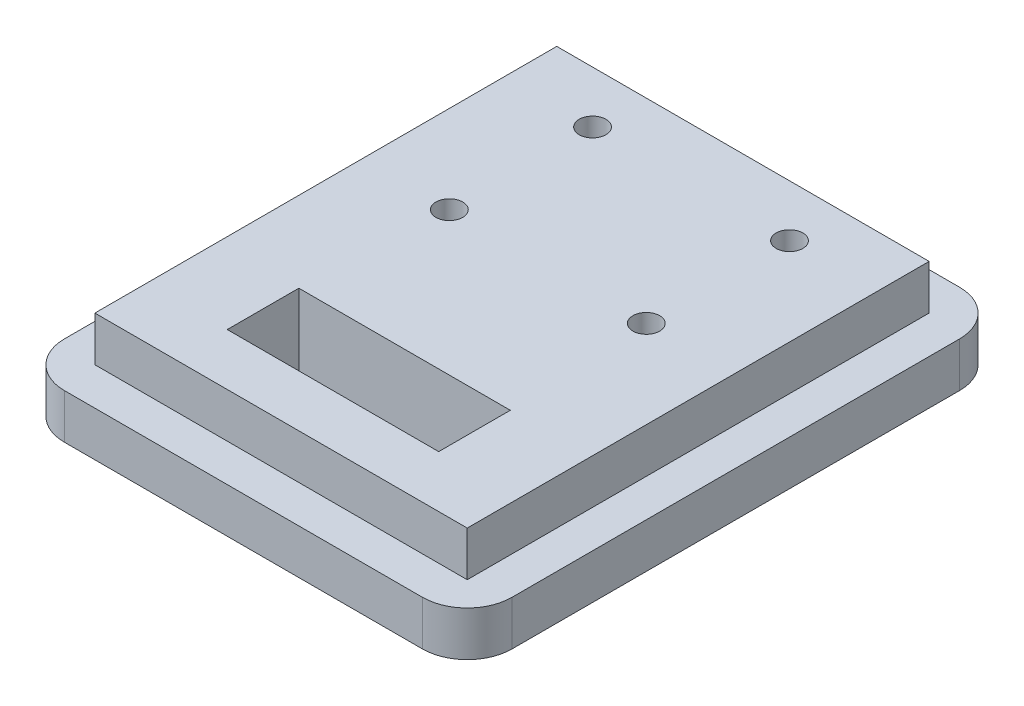
ISO-10303-21;
HEADER;
FILE_DESCRIPTION(('STEP AP214'),'2;1');
FILE_NAME('part.step','',(''),(''),'','','');
FILE_SCHEMA(('AUTOMOTIVE_DESIGN { 1 0 10303 214 1 1 1 1 }'));
ENDSEC;
DATA;
#1=APPLICATION_CONTEXT('core data for automotive mechanical design processes');
#2=APPLICATION_PROTOCOL_DEFINITION('international standard','automotive_design',2000,#1);
#3=PRODUCT_CONTEXT('',#1,'mechanical');
#4=PRODUCT('Part','Part','',(#3));
#5=PRODUCT_RELATED_PRODUCT_CATEGORY('part','',(#4));
#6=PRODUCT_DEFINITION_FORMATION('','',#4);
#7=PRODUCT_DEFINITION_CONTEXT('part definition',#1,'design');
#8=PRODUCT_DEFINITION('design','',#6,#7);
#9=PRODUCT_DEFINITION_SHAPE('','',#8);
#10=(LENGTH_UNIT() NAMED_UNIT(*) SI_UNIT(.MILLI.,.METRE.));
#11=(NAMED_UNIT(*) PLANE_ANGLE_UNIT() SI_UNIT($,.RADIAN.));
#12=(NAMED_UNIT(*) SI_UNIT($,.STERADIAN.) SOLID_ANGLE_UNIT());
#13=UNCERTAINTY_MEASURE_WITH_UNIT(LENGTH_MEASURE(1.E-05),#10,'distance_accuracy_value','');
#14=(GEOMETRIC_REPRESENTATION_CONTEXT(3) GLOBAL_UNCERTAINTY_ASSIGNED_CONTEXT((#13)) GLOBAL_UNIT_ASSIGNED_CONTEXT((#10,
#11,#12)) REPRESENTATION_CONTEXT('',''));
#15=CARTESIAN_POINT('',(0.,0.,0.));
#16=DIRECTION('',(0.,0.,1.));
#17=DIRECTION('',(1.,0.,0.));
#18=AXIS2_PLACEMENT_3D('',#15,#16,#17);
#19=CARTESIAN_POINT('',(15.875,6.35,19.05));
#20=DIRECTION('',(-1.,0.,0.));
#21=DIRECTION('',(0.,0.,1.));
#22=AXIS2_PLACEMENT_3D('',#19,#20,#21);
#23=PLANE('',#22);
#24=DIRECTION('',(0.,0.,-1.));
#25=VECTOR('',#24,1.);
#26=CARTESIAN_POINT('',(15.875,3.175,19.05));
#27=LINE('',#26,#25);
#28=CARTESIAN_POINT('',(15.875,3.175,15.875));
#29=VERTEX_POINT('',#28);
#30=CARTESIAN_POINT('',(15.875,3.175,-15.875));
#31=VERTEX_POINT('',#30);
#32=EDGE_CURVE('E214',#29,#31,#27,.T.);
#33=ORIENTED_EDGE('',*,*,#32,.F.);
#34=DIRECTION('',(0.,-1.,0.));
#35=VECTOR('',#34,1.);
#36=CARTESIAN_POINT('',(15.875,6.35,15.875));
#37=LINE('',#36,#35);
#38=CARTESIAN_POINT('',(15.875,0.,15.875));
#39=VERTEX_POINT('',#38);
#40=EDGE_CURVE('E318',#29,#39,#37,.T.);
#41=ORIENTED_EDGE('',*,*,#40,.T.);
#42=DIRECTION('',(0.,0.,-1.));
#43=VECTOR('',#42,1.);
#44=CARTESIAN_POINT('',(15.875,0.,19.05));
#45=LINE('',#44,#43);
#46=CARTESIAN_POINT('',(15.875,0.,-15.875));
#47=VERTEX_POINT('',#46);
#48=EDGE_CURVE('E297',#39,#47,#45,.T.);
#49=ORIENTED_EDGE('',*,*,#48,.T.);
#50=DIRECTION('',(0.,-1.,0.));
#51=VECTOR('',#50,1.);
#52=CARTESIAN_POINT('',(15.875,6.35,-15.875));
#53=LINE('',#52,#51);
#54=EDGE_CURVE('E315',#47,#31,#53,.F.);
#55=ORIENTED_EDGE('',*,*,#54,.T.);
#56=EDGE_LOOP('',(#33,#41,#49,#55));
#57=FACE_BOUND('',#56,.T.);
#58=ADVANCED_FACE('F39',(#57),#23,.F.);
#59=CARTESIAN_POINT('',(-15.875,6.35,-19.05));
#60=DIRECTION('',(0.,0.,1.));
#61=DIRECTION('',(1.,0.,0.));
#62=AXIS2_PLACEMENT_3D('',#59,#60,#61);
#63=PLANE('',#62);
#64=DIRECTION('',(-1.,0.,0.));
#65=VECTOR('',#64,1.);
#66=CARTESIAN_POINT('',(15.875,3.175,-19.05));
#67=LINE('',#66,#65);
#68=CARTESIAN_POINT('',(12.7,3.175,-19.05));
#69=VERTEX_POINT('',#68);
#70=CARTESIAN_POINT('',(-12.7,3.175,-19.05));
#71=VERTEX_POINT('',#70);
#72=EDGE_CURVE('E218',#69,#71,#67,.T.);
#73=ORIENTED_EDGE('',*,*,#72,.F.);
#74=DIRECTION('',(0.,-1.,0.));
#75=VECTOR('',#74,1.);
#76=CARTESIAN_POINT('',(12.7,6.35,-19.05));
#77=LINE('',#76,#75);
#78=CARTESIAN_POINT('',(12.7,0.,-19.05));
#79=VERTEX_POINT('',#78);
#80=EDGE_CURVE('E11',#69,#79,#77,.T.);
#81=ORIENTED_EDGE('',*,*,#80,.T.);
#82=DIRECTION('',(-1.,0.,0.));
#83=VECTOR('',#82,1.);
#84=CARTESIAN_POINT('',(-15.875,0.,-19.05));
#85=LINE('',#84,#83);
#86=CARTESIAN_POINT('',(-12.7,0.,-19.05));
#87=VERTEX_POINT('',#86);
#88=EDGE_CURVE('E304',#79,#87,#85,.T.);
#89=ORIENTED_EDGE('',*,*,#88,.T.);
#90=DIRECTION('',(0.,-1.,0.));
#91=VECTOR('',#90,1.);
#92=CARTESIAN_POINT('',(-12.7,6.35,-19.05));
#93=LINE('',#92,#91);
#94=EDGE_CURVE('E48',#87,#71,#93,.F.);
#95=ORIENTED_EDGE('',*,*,#94,.T.);
#96=EDGE_LOOP('',(#73,#81,#89,#95));
#97=FACE_BOUND('',#96,.T.);
#98=ADVANCED_FACE('F361',(#97),#63,.F.);
#99=CARTESIAN_POINT('',(-15.875,6.35,19.05));
#100=DIRECTION('',(1.,0.,0.));
#101=DIRECTION('',(0.,0.,-1.));
#102=AXIS2_PLACEMENT_3D('',#99,#100,#101);
#103=PLANE('',#102);
#104=DIRECTION('',(0.,0.,1.));
#105=VECTOR('',#104,1.);
#106=CARTESIAN_POINT('',(-15.875,0.,19.05));
#107=LINE('',#106,#105);
#108=CARTESIAN_POINT('',(-15.875,0.,-15.875));
#109=VERTEX_POINT('',#108);
#110=CARTESIAN_POINT('',(-15.875,0.,15.875));
#111=VERTEX_POINT('',#110);
#112=EDGE_CURVE('E308',#109,#111,#107,.T.);
#113=ORIENTED_EDGE('',*,*,#112,.T.);
#114=DIRECTION('',(0.,-1.,0.));
#115=VECTOR('',#114,1.);
#116=CARTESIAN_POINT('',(-15.875,6.35,15.875));
#117=LINE('',#116,#115);
#118=CARTESIAN_POINT('',(-15.875,3.175,15.875));
#119=VERTEX_POINT('',#118);
#120=EDGE_CURVE('E55',#111,#119,#117,.F.);
#121=ORIENTED_EDGE('',*,*,#120,.T.);
#122=DIRECTION('',(0.,0.,1.));
#123=VECTOR('',#122,1.);
#124=CARTESIAN_POINT('',(-15.875,3.175,-19.05));
#125=LINE('',#124,#123);
#126=CARTESIAN_POINT('',(-15.875,3.175,-15.875));
#127=VERTEX_POINT('',#126);
#128=EDGE_CURVE('E221',#127,#119,#125,.T.);
#129=ORIENTED_EDGE('',*,*,#128,.F.);
#130=DIRECTION('',(0.,-1.,0.));
#131=VECTOR('',#130,1.);
#132=CARTESIAN_POINT('',(-15.875,6.35,-15.875));
#133=LINE('',#132,#131);
#134=EDGE_CURVE('E352',#127,#109,#133,.T.);
#135=ORIENTED_EDGE('',*,*,#134,.T.);
#136=EDGE_LOOP('',(#113,#121,#129,#135));
#137=FACE_BOUND('',#136,.T.);
#138=ADVANCED_FACE('F368',(#137),#103,.F.);
#139=CARTESIAN_POINT('',(-15.875,6.35,19.05));
#140=DIRECTION('',(0.,0.,-1.));
#141=DIRECTION('',(-1.,0.,0.));
#142=AXIS2_PLACEMENT_3D('',#139,#140,#141);
#143=PLANE('',#142);
#144=DIRECTION('',(1.,0.,0.));
#145=VECTOR('',#144,1.);
#146=CARTESIAN_POINT('',(-15.875,0.,19.05));
#147=LINE('',#146,#145);
#148=CARTESIAN_POINT('',(-12.7,0.,19.05));
#149=VERTEX_POINT('',#148);
#150=CARTESIAN_POINT('',(12.7,0.,19.05));
#151=VERTEX_POINT('',#150);
#152=EDGE_CURVE('E311',#149,#151,#147,.T.);
#153=ORIENTED_EDGE('',*,*,#152,.T.);
#154=DIRECTION('',(0.,-1.,0.));
#155=VECTOR('',#154,1.);
#156=CARTESIAN_POINT('',(12.7,6.35,19.05));
#157=LINE('',#156,#155);
#158=CARTESIAN_POINT('',(12.7,3.175,19.05));
#159=VERTEX_POINT('',#158);
#160=EDGE_CURVE('E338',#151,#159,#157,.F.);
#161=ORIENTED_EDGE('',*,*,#160,.T.);
#162=DIRECTION('',(1.,0.,0.));
#163=VECTOR('',#162,1.);
#164=CARTESIAN_POINT('',(-15.875,3.175,19.05));
#165=LINE('',#164,#163);
#166=CARTESIAN_POINT('',(-12.7,3.175,19.05));
#167=VERTEX_POINT('',#166);
#168=EDGE_CURVE('E205',#167,#159,#165,.T.);
#169=ORIENTED_EDGE('',*,*,#168,.F.);
#170=DIRECTION('',(0.,-1.,0.));
#171=VECTOR('',#170,1.);
#172=CARTESIAN_POINT('',(-12.7,6.35,19.05));
#173=LINE('',#172,#171);
#174=EDGE_CURVE('E334',#167,#149,#173,.T.);
#175=ORIENTED_EDGE('',*,*,#174,.T.);
#176=EDGE_LOOP('',(#153,#161,#169,#175));
#177=FACE_BOUND('',#176,.T.);
#178=ADVANCED_FACE('F379',(#177),#143,.F.);
#179=CARTESIAN_POINT('',(0.,6.35,0.));
#180=DIRECTION('',(0.,-1.,0.));
#181=DIRECTION('',(0.,0.,-1.));
#182=AXIS2_PLACEMENT_3D('',#179,#180,#181);
#183=PLANE('',#182);
#184=CARTESIAN_POINT('',(-6.985,6.35,-2.54));
#185=DIRECTION('',(0.,1.,0.));
#186=DIRECTION('',(0.,0.,1.));
#187=AXIS2_PLACEMENT_3D('',#184,#185,#186);
#188=CIRCLE('',#187,0.95);
#189=CARTESIAN_POINT('',(-6.985,6.35,-1.59));
#190=VERTEX_POINT('',#189);
#191=EDGE_CURVE('E281',#190,#190,#188,.T.);
#192=ORIENTED_EDGE('',*,*,#191,.F.);
#193=EDGE_LOOP('',(#192));
#194=FACE_BOUND('',#193,.T.);
#195=CARTESIAN_POINT('',(6.985,6.35,-12.7));
#196=DIRECTION('',(0.,1.,0.));
#197=DIRECTION('',(0.,0.,1.));
#198=AXIS2_PLACEMENT_3D('',#195,#196,#197);
#199=CIRCLE('',#198,0.95);
#200=CARTESIAN_POINT('',(6.985,6.35,-11.75));
#201=VERTEX_POINT('',#200);
#202=EDGE_CURVE('E259',#201,#201,#199,.T.);
#203=ORIENTED_EDGE('',*,*,#202,.F.);
#204=EDGE_LOOP('',(#203));
#205=FACE_BOUND('',#204,.T.);
#206=CARTESIAN_POINT('',(-6.985,6.35,-12.7));
#207=DIRECTION('',(0.,1.,0.));
#208=DIRECTION('',(0.,0.,1.));
#209=AXIS2_PLACEMENT_3D('',#206,#207,#208);
#210=CIRCLE('',#209,0.95);
#211=CARTESIAN_POINT('',(-6.985,6.35,-11.75));
#212=VERTEX_POINT('',#211);
#213=EDGE_CURVE('E273',#212,#212,#210,.T.);
#214=ORIENTED_EDGE('',*,*,#213,.F.);
#215=EDGE_LOOP('',(#214));
#216=FACE_BOUND('',#215,.T.);
#217=CARTESIAN_POINT('',(6.985,6.35,-2.54));
#218=DIRECTION('',(0.,1.,0.));
#219=DIRECTION('',(0.,0.,1.));
#220=AXIS2_PLACEMENT_3D('',#217,#218,#219);
#221=CIRCLE('',#220,0.95);
#222=CARTESIAN_POINT('',(6.985,6.35,-1.59));
#223=VERTEX_POINT('',#222);
#224=EDGE_CURVE('E282',#223,#223,#221,.T.);
#225=ORIENTED_EDGE('',*,*,#224,.F.);
#226=EDGE_LOOP('',(#225));
#227=FACE_BOUND('',#226,.T.);
#228=DIRECTION('',(-1.,0.,0.));
#229=VECTOR('',#228,1.);
#230=CARTESIAN_POINT('',(-7.5,6.35,7.62));
#231=LINE('',#230,#229);
#232=CARTESIAN_POINT('',(7.5,6.35,7.62));
#233=VERTEX_POINT('',#232);
#234=CARTESIAN_POINT('',(-7.5,6.35,7.62));
#235=VERTEX_POINT('',#234);
#236=EDGE_CURVE('E245',#233,#235,#231,.T.);
#237=ORIENTED_EDGE('',*,*,#236,.F.);
#238=DIRECTION('',(0.,0.,-1.));
#239=VECTOR('',#238,1.);
#240=CARTESIAN_POINT('',(7.5,6.35,12.7));
#241=LINE('',#240,#239);
#242=CARTESIAN_POINT('',(7.5,6.35,12.7));
#243=VERTEX_POINT('',#242);
#244=EDGE_CURVE('E224',#243,#233,#241,.T.);
#245=ORIENTED_EDGE('',*,*,#244,.F.);
#246=DIRECTION('',(1.,0.,0.));
#247=VECTOR('',#246,1.);
#248=CARTESIAN_POINT('',(-7.5,6.35,12.7));
#249=LINE('',#248,#247);
#250=CARTESIAN_POINT('',(-7.5,6.35,12.7));
#251=VERTEX_POINT('',#250);
#252=EDGE_CURVE('E230',#251,#243,#249,.T.);
#253=ORIENTED_EDGE('',*,*,#252,.F.);
#254=DIRECTION('',(0.,0.,1.));
#255=VECTOR('',#254,1.);
#256=CARTESIAN_POINT('',(-7.5,6.35,12.7));
#257=LINE('',#256,#255);
#258=EDGE_CURVE('E249',#235,#251,#257,.T.);
#259=ORIENTED_EDGE('',*,*,#258,.F.);
#260=EDGE_LOOP('',(#237,#245,#253,#259));
#261=FACE_BOUND('',#260,.T.);
#262=DIRECTION('',(0.,0.,-1.));
#263=VECTOR('',#262,1.);
#264=CARTESIAN_POINT('',(13.208,6.35,16.383));
#265=LINE('',#264,#263);
#266=CARTESIAN_POINT('',(13.208,6.35,16.383));
#267=VERTEX_POINT('',#266);
#268=CARTESIAN_POINT('',(13.208,6.35,-16.383));
#269=VERTEX_POINT('',#268);
#270=EDGE_CURVE('E195',#267,#269,#265,.T.);
#271=ORIENTED_EDGE('',*,*,#270,.T.);
#272=DIRECTION('',(-1.,0.,0.));
#273=VECTOR('',#272,1.);
#274=CARTESIAN_POINT('',(-13.208,6.35,-16.383));
#275=LINE('',#274,#273);
#276=CARTESIAN_POINT('',(-13.208,6.35,-16.383));
#277=VERTEX_POINT('',#276);
#278=EDGE_CURVE('E161',#269,#277,#275,.T.);
#279=ORIENTED_EDGE('',*,*,#278,.T.);
#280=DIRECTION('',(0.,0.,1.));
#281=VECTOR('',#280,1.);
#282=CARTESIAN_POINT('',(-13.208,6.35,16.383));
#283=LINE('',#282,#281);
#284=CARTESIAN_POINT('',(-13.208,6.35,16.383));
#285=VERTEX_POINT('',#284);
#286=EDGE_CURVE('E188',#277,#285,#283,.T.);
#287=ORIENTED_EDGE('',*,*,#286,.T.);
#288=DIRECTION('',(1.,0.,0.));
#289=VECTOR('',#288,1.);
#290=CARTESIAN_POINT('',(-13.208,6.35,16.383));
#291=LINE('',#290,#289);
#292=EDGE_CURVE('E184',#285,#267,#291,.T.);
#293=ORIENTED_EDGE('',*,*,#292,.T.);
#294=EDGE_LOOP('',(#271,#279,#287,#293));
#295=FACE_BOUND('',#294,.T.);
#296=ADVANCED_FACE('F454',(#194,#205,#216,#227,#261,#295),#183,.F.);
#297=CARTESIAN_POINT('',(0.,0.,0.));
#298=DIRECTION('',(0.,-1.,0.));
#299=DIRECTION('',(0.,0.,-1.));
#300=AXIS2_PLACEMENT_3D('',#297,#298,#299);
#301=PLANE('',#300);
#302=DIRECTION('',(0.,0.,-1.));
#303=VECTOR('',#302,1.);
#304=CARTESIAN_POINT('',(7.5,0.,12.7));
#305=LINE('',#304,#303);
#306=CARTESIAN_POINT('',(7.5,0.,12.7));
#307=VERTEX_POINT('',#306);
#308=CARTESIAN_POINT('',(7.5,0.,7.62));
#309=VERTEX_POINT('',#308);
#310=EDGE_CURVE('E225',#307,#309,#305,.T.);
#311=ORIENTED_EDGE('',*,*,#310,.T.);
#312=DIRECTION('',(-1.,0.,0.));
#313=VECTOR('',#312,1.);
#314=CARTESIAN_POINT('',(-7.5,0.,7.62));
#315=LINE('',#314,#313);
#316=CARTESIAN_POINT('',(-7.5,0.,7.62));
#317=VERTEX_POINT('',#316);
#318=EDGE_CURVE('E229',#309,#317,#315,.T.);
#319=ORIENTED_EDGE('',*,*,#318,.T.);
#320=DIRECTION('',(0.,0.,1.));
#321=VECTOR('',#320,1.);
#322=CARTESIAN_POINT('',(-7.5,0.,12.7));
#323=LINE('',#322,#321);
#324=CARTESIAN_POINT('',(-7.5,0.,12.7));
#325=VERTEX_POINT('',#324);
#326=EDGE_CURVE('E234',#317,#325,#323,.T.);
#327=ORIENTED_EDGE('',*,*,#326,.T.);
#328=DIRECTION('',(1.,0.,0.));
#329=VECTOR('',#328,1.);
#330=CARTESIAN_POINT('',(-7.5,0.,12.7));
#331=LINE('',#330,#329);
#332=EDGE_CURVE('E238',#325,#307,#331,.T.);
#333=ORIENTED_EDGE('',*,*,#332,.T.);
#334=EDGE_LOOP('',(#311,#319,#327,#333));
#335=FACE_BOUND('',#334,.T.);
#336=CARTESIAN_POINT('',(6.985,0.,-2.54));
#337=DIRECTION('',(0.,1.,0.));
#338=DIRECTION('',(0.,0.,1.));
#339=AXIS2_PLACEMENT_3D('',#336,#337,#338);
#340=CIRCLE('',#339,0.95);
#341=CARTESIAN_POINT('',(6.985,0.,-1.59));
#342=VERTEX_POINT('',#341);
#343=EDGE_CURVE('E277',#342,#342,#340,.T.);
#344=ORIENTED_EDGE('',*,*,#343,.T.);
#345=EDGE_LOOP('',(#344));
#346=FACE_BOUND('',#345,.T.);
#347=CARTESIAN_POINT('',(-6.985,0.,-12.7));
#348=DIRECTION('',(0.,1.,0.));
#349=DIRECTION('',(0.,0.,1.));
#350=AXIS2_PLACEMENT_3D('',#347,#348,#349);
#351=CIRCLE('',#350,0.95);
#352=CARTESIAN_POINT('',(-6.985,0.,-11.75));
#353=VERTEX_POINT('',#352);
#354=EDGE_CURVE('E286',#353,#353,#351,.T.);
#355=ORIENTED_EDGE('',*,*,#354,.T.);
#356=EDGE_LOOP('',(#355));
#357=FACE_BOUND('',#356,.T.);
#358=CARTESIAN_POINT('',(6.985,0.,-12.7));
#359=DIRECTION('',(0.,1.,0.));
#360=DIRECTION('',(0.,0.,1.));
#361=AXIS2_PLACEMENT_3D('',#358,#359,#360);
#362=CIRCLE('',#361,0.95);
#363=CARTESIAN_POINT('',(6.985,0.,-11.75));
#364=VERTEX_POINT('',#363);
#365=EDGE_CURVE('E269',#364,#364,#362,.T.);
#366=ORIENTED_EDGE('',*,*,#365,.T.);
#367=EDGE_LOOP('',(#366));
#368=FACE_BOUND('',#367,.T.);
#369=CARTESIAN_POINT('',(-6.985,0.,-2.54));
#370=DIRECTION('',(0.,1.,0.));
#371=DIRECTION('',(0.,0.,1.));
#372=AXIS2_PLACEMENT_3D('',#369,#370,#371);
#373=CIRCLE('',#372,0.95);
#374=CARTESIAN_POINT('',(-6.985,0.,-1.59));
#375=VERTEX_POINT('',#374);
#376=EDGE_CURVE('E293',#375,#375,#373,.T.);
#377=ORIENTED_EDGE('',*,*,#376,.T.);
#378=EDGE_LOOP('',(#377));
#379=FACE_BOUND('',#378,.T.);
#380=ORIENTED_EDGE('',*,*,#48,.F.);
#381=CARTESIAN_POINT('',(12.7,0.,15.875));
#382=DIRECTION('',(0.,-1.,0.));
#383=DIRECTION('',(0.,0.,-1.));
#384=AXIS2_PLACEMENT_3D('',#381,#382,#383);
#385=CIRCLE('',#384,3.175);
#386=EDGE_CURVE('E331',#39,#151,#385,.T.);
#387=ORIENTED_EDGE('',*,*,#386,.T.);
#388=ORIENTED_EDGE('',*,*,#152,.F.);
#389=CARTESIAN_POINT('',(-12.7,0.,15.875));
#390=DIRECTION('',(0.,-1.,0.));
#391=DIRECTION('',(0.,0.,-1.));
#392=AXIS2_PLACEMENT_3D('',#389,#390,#391);
#393=CIRCLE('',#392,3.175);
#394=EDGE_CURVE('E328',#149,#111,#393,.T.);
#395=ORIENTED_EDGE('',*,*,#394,.T.);
#396=ORIENTED_EDGE('',*,*,#112,.F.);
#397=CARTESIAN_POINT('',(-12.7,0.,-15.875));
#398=DIRECTION('',(0.,-1.,0.));
#399=DIRECTION('',(0.,0.,-1.));
#400=AXIS2_PLACEMENT_3D('',#397,#398,#399);
#401=CIRCLE('',#400,3.175);
#402=EDGE_CURVE('E322',#109,#87,#401,.T.);
#403=ORIENTED_EDGE('',*,*,#402,.T.);
#404=ORIENTED_EDGE('',*,*,#88,.F.);
#405=CARTESIAN_POINT('',(12.7,0.,-15.875));
#406=DIRECTION('',(0.,-1.,0.));
#407=DIRECTION('',(0.,0.,-1.));
#408=AXIS2_PLACEMENT_3D('',#405,#406,#407);
#409=CIRCLE('',#408,3.175);
#410=EDGE_CURVE('E325',#79,#47,#409,.T.);
#411=ORIENTED_EDGE('',*,*,#410,.T.);
#412=EDGE_LOOP('',(#380,#387,#388,#395,#396,#403,#404,#411));
#413=FACE_BOUND('',#412,.T.);
#414=ADVANCED_FACE('F371',(#335,#346,#357,#368,#379,#413),#301,.T.);
#415=CARTESIAN_POINT('',(-6.985,0.,-2.54));
#416=DIRECTION('',(0.,1.,0.));
#417=DIRECTION('',(0.,0.,1.));
#418=AXIS2_PLACEMENT_3D('',#415,#416,#417);
#419=CYLINDRICAL_SURFACE('',#418,0.95);
#420=ORIENTED_EDGE('',*,*,#376,.F.);
#421=EDGE_LOOP('',(#420));
#422=FACE_BOUND('',#421,.T.);
#423=ORIENTED_EDGE('',*,*,#191,.T.);
#424=EDGE_LOOP('',(#423));
#425=FACE_BOUND('',#424,.T.);
#426=ADVANCED_FACE('F443',(#422,#425),#419,.F.);
#427=CARTESIAN_POINT('',(6.985,0.,-12.7));
#428=DIRECTION('',(0.,1.,0.));
#429=DIRECTION('',(0.,0.,1.));
#430=AXIS2_PLACEMENT_3D('',#427,#428,#429);
#431=CYLINDRICAL_SURFACE('',#430,0.95);
#432=ORIENTED_EDGE('',*,*,#365,.F.);
#433=EDGE_LOOP('',(#432));
#434=FACE_BOUND('',#433,.T.);
#435=ORIENTED_EDGE('',*,*,#202,.T.);
#436=EDGE_LOOP('',(#435));
#437=FACE_BOUND('',#436,.T.);
#438=ADVANCED_FACE('F439',(#434,#437),#431,.F.);
#439=CARTESIAN_POINT('',(-6.985,0.,-12.7));
#440=DIRECTION('',(0.,1.,0.));
#441=DIRECTION('',(0.,0.,1.));
#442=AXIS2_PLACEMENT_3D('',#439,#440,#441);
#443=CYLINDRICAL_SURFACE('',#442,0.95);
#444=ORIENTED_EDGE('',*,*,#354,.F.);
#445=EDGE_LOOP('',(#444));
#446=FACE_BOUND('',#445,.T.);
#447=ORIENTED_EDGE('',*,*,#213,.T.);
#448=EDGE_LOOP('',(#447));
#449=FACE_BOUND('',#448,.T.);
#450=ADVANCED_FACE('F442',(#446,#449),#443,.F.);
#451=CARTESIAN_POINT('',(6.985,0.,-2.54));
#452=DIRECTION('',(0.,1.,0.));
#453=DIRECTION('',(0.,0.,1.));
#454=AXIS2_PLACEMENT_3D('',#451,#452,#453);
#455=CYLINDRICAL_SURFACE('',#454,0.95);
#456=ORIENTED_EDGE('',*,*,#343,.F.);
#457=EDGE_LOOP('',(#456));
#458=FACE_BOUND('',#457,.T.);
#459=ORIENTED_EDGE('',*,*,#224,.T.);
#460=EDGE_LOOP('',(#459));
#461=FACE_BOUND('',#460,.T.);
#462=ADVANCED_FACE('F437',(#458,#461),#455,.F.);
#463=CARTESIAN_POINT('',(7.5,0.,12.7));
#464=DIRECTION('',(1.,0.,0.));
#465=DIRECTION('',(0.,0.,-1.));
#466=AXIS2_PLACEMENT_3D('',#463,#464,#465);
#467=PLANE('',#466);
#468=ORIENTED_EDGE('',*,*,#244,.T.);
#469=DIRECTION('',(0.,1.,0.));
#470=VECTOR('',#469,1.);
#471=CARTESIAN_POINT('',(7.5,0.,7.62));
#472=LINE('',#471,#470);
#473=EDGE_CURVE('E242',#309,#233,#472,.T.);
#474=ORIENTED_EDGE('',*,*,#473,.F.);
#475=ORIENTED_EDGE('',*,*,#310,.F.);
#476=DIRECTION('',(0.,1.,0.));
#477=VECTOR('',#476,1.);
#478=CARTESIAN_POINT('',(7.5,0.,12.7));
#479=LINE('',#478,#477);
#480=EDGE_CURVE('E256',#307,#243,#479,.T.);
#481=ORIENTED_EDGE('',*,*,#480,.T.);
#482=EDGE_LOOP('',(#468,#474,#475,#481));
#483=FACE_BOUND('',#482,.T.);
#484=ADVANCED_FACE('F427',(#483),#467,.F.);
#485=CARTESIAN_POINT('',(-7.5,0.,12.7));
#486=DIRECTION('',(0.,0.,1.));
#487=DIRECTION('',(1.,0.,0.));
#488=AXIS2_PLACEMENT_3D('',#485,#486,#487);
#489=PLANE('',#488);
#490=ORIENTED_EDGE('',*,*,#252,.T.);
#491=ORIENTED_EDGE('',*,*,#480,.F.);
#492=ORIENTED_EDGE('',*,*,#332,.F.);
#493=DIRECTION('',(0.,1.,0.));
#494=VECTOR('',#493,1.);
#495=CARTESIAN_POINT('',(-7.5,0.,12.7));
#496=LINE('',#495,#494);
#497=EDGE_CURVE('E260',#325,#251,#496,.T.);
#498=ORIENTED_EDGE('',*,*,#497,.T.);
#499=EDGE_LOOP('',(#490,#491,#492,#498));
#500=FACE_BOUND('',#499,.T.);
#501=ADVANCED_FACE('F423',(#500),#489,.F.);
#502=CARTESIAN_POINT('',(-7.5,0.,12.7));
#503=DIRECTION('',(-1.,0.,0.));
#504=DIRECTION('',(0.,0.,1.));
#505=AXIS2_PLACEMENT_3D('',#502,#503,#504);
#506=PLANE('',#505);
#507=ORIENTED_EDGE('',*,*,#258,.T.);
#508=ORIENTED_EDGE('',*,*,#497,.F.);
#509=ORIENTED_EDGE('',*,*,#326,.F.);
#510=DIRECTION('',(0.,1.,0.));
#511=VECTOR('',#510,1.);
#512=CARTESIAN_POINT('',(-7.5,0.,7.62));
#513=LINE('',#512,#511);
#514=EDGE_CURVE('E263',#317,#235,#513,.T.);
#515=ORIENTED_EDGE('',*,*,#514,.T.);
#516=EDGE_LOOP('',(#507,#508,#509,#515));
#517=FACE_BOUND('',#516,.T.);
#518=ADVANCED_FACE('F426',(#517),#506,.F.);
#519=CARTESIAN_POINT('',(-7.5,0.,7.62));
#520=DIRECTION('',(0.,0.,-1.));
#521=DIRECTION('',(-1.,0.,0.));
#522=AXIS2_PLACEMENT_3D('',#519,#520,#521);
#523=PLANE('',#522);
#524=ORIENTED_EDGE('',*,*,#236,.T.);
#525=ORIENTED_EDGE('',*,*,#514,.F.);
#526=ORIENTED_EDGE('',*,*,#318,.F.);
#527=ORIENTED_EDGE('',*,*,#473,.T.);
#528=EDGE_LOOP('',(#524,#525,#526,#527));
#529=FACE_BOUND('',#528,.T.);
#530=ADVANCED_FACE('F422',(#529),#523,.F.);
#531=CARTESIAN_POINT('',(0.,3.175,0.));
#532=DIRECTION('',(0.,1.,0.));
#533=DIRECTION('',(0.,0.,1.));
#534=AXIS2_PLACEMENT_3D('',#531,#532,#533);
#535=PLANE('',#534);
#536=DIRECTION('',(1.,0.,0.));
#537=VECTOR('',#536,1.);
#538=CARTESIAN_POINT('',(-13.208,3.175,16.383));
#539=LINE('',#538,#537);
#540=CARTESIAN_POINT('',(-13.208,3.175,16.383));
#541=VERTEX_POINT('',#540);
#542=CARTESIAN_POINT('',(13.208,3.175,16.383));
#543=VERTEX_POINT('',#542);
#544=EDGE_CURVE('E168',#541,#543,#539,.T.);
#545=ORIENTED_EDGE('',*,*,#544,.F.);
#546=DIRECTION('',(0.,0.,1.));
#547=VECTOR('',#546,1.);
#548=CARTESIAN_POINT('',(-13.208,3.175,16.383));
#549=LINE('',#548,#547);
#550=CARTESIAN_POINT('',(-13.208,3.175,-16.383));
#551=VERTEX_POINT('',#550);
#552=EDGE_CURVE('E177',#551,#541,#549,.T.);
#553=ORIENTED_EDGE('',*,*,#552,.F.);
#554=DIRECTION('',(-1.,0.,0.));
#555=VECTOR('',#554,1.);
#556=CARTESIAN_POINT('',(-13.208,3.175,-16.383));
#557=LINE('',#556,#555);
#558=CARTESIAN_POINT('',(13.208,3.175,-16.383));
#559=VERTEX_POINT('',#558);
#560=EDGE_CURVE('E159',#559,#551,#557,.T.);
#561=ORIENTED_EDGE('',*,*,#560,.F.);
#562=DIRECTION('',(0.,0.,-1.));
#563=VECTOR('',#562,1.);
#564=CARTESIAN_POINT('',(13.208,3.175,16.383));
#565=LINE('',#564,#563);
#566=EDGE_CURVE('E174',#543,#559,#565,.T.);
#567=ORIENTED_EDGE('',*,*,#566,.F.);
#568=EDGE_LOOP('',(#545,#553,#561,#567));
#569=FACE_BOUND('',#568,.T.);
#570=ORIENTED_EDGE('',*,*,#168,.T.);
#571=CARTESIAN_POINT('',(12.7,3.175,15.875));
#572=DIRECTION('',(0.,1.,0.));
#573=DIRECTION('',(0.,0.,1.));
#574=AXIS2_PLACEMENT_3D('',#571,#572,#573);
#575=CIRCLE('',#574,3.175);
#576=EDGE_CURVE('E349',#159,#29,#575,.T.);
#577=ORIENTED_EDGE('',*,*,#576,.T.);
#578=ORIENTED_EDGE('',*,*,#32,.T.);
#579=CARTESIAN_POINT('',(12.7,3.175,-15.875));
#580=DIRECTION('',(0.,1.,0.));
#581=DIRECTION('',(0.,0.,1.));
#582=AXIS2_PLACEMENT_3D('',#579,#580,#581);
#583=CIRCLE('',#582,3.175);
#584=EDGE_CURVE('E343',#31,#69,#583,.T.);
#585=ORIENTED_EDGE('',*,*,#584,.T.);
#586=ORIENTED_EDGE('',*,*,#72,.T.);
#587=CARTESIAN_POINT('',(-12.7,3.175,-15.875));
#588=DIRECTION('',(0.,1.,0.));
#589=DIRECTION('',(0.,0.,1.));
#590=AXIS2_PLACEMENT_3D('',#587,#588,#589);
#591=CIRCLE('',#590,3.175);
#592=EDGE_CURVE('E62',#71,#127,#591,.T.);
#593=ORIENTED_EDGE('',*,*,#592,.T.);
#594=ORIENTED_EDGE('',*,*,#128,.T.);
#595=CARTESIAN_POINT('',(-12.7,3.175,15.875));
#596=DIRECTION('',(0.,1.,0.));
#597=DIRECTION('',(0.,0.,1.));
#598=AXIS2_PLACEMENT_3D('',#595,#596,#597);
#599=CIRCLE('',#598,3.175);
#600=EDGE_CURVE('E346',#119,#167,#599,.T.);
#601=ORIENTED_EDGE('',*,*,#600,.T.);
#602=EDGE_LOOP('',(#570,#577,#578,#585,#586,#593,#594,#601));
#603=FACE_BOUND('',#602,.T.);
#604=ADVANCED_FACE('F173',(#569,#603),#535,.T.);
#605=CARTESIAN_POINT('',(13.208,3.175,16.383));
#606=DIRECTION('',(1.,0.,0.));
#607=DIRECTION('',(0.,0.,-1.));
#608=AXIS2_PLACEMENT_3D('',#605,#606,#607);
#609=PLANE('',#608);
#610=ORIENTED_EDGE('',*,*,#270,.F.);
#611=DIRECTION('',(0.,1.,0.));
#612=VECTOR('',#611,1.);
#613=CARTESIAN_POINT('',(13.208,3.175,16.383));
#614=LINE('',#613,#612);
#615=EDGE_CURVE('E182',#543,#267,#614,.T.);
#616=ORIENTED_EDGE('',*,*,#615,.F.);
#617=ORIENTED_EDGE('',*,*,#566,.T.);
#618=DIRECTION('',(0.,1.,0.));
#619=VECTOR('',#618,1.);
#620=CARTESIAN_POINT('',(13.208,3.175,-16.383));
#621=LINE('',#620,#619);
#622=EDGE_CURVE('E155',#559,#269,#621,.T.);
#623=ORIENTED_EDGE('',*,*,#622,.T.);
#624=EDGE_LOOP('',(#610,#616,#617,#623));
#625=FACE_BOUND('',#624,.T.);
#626=ADVANCED_FACE('F181',(#625),#609,.T.);
#627=CARTESIAN_POINT('',(-13.208,3.175,16.383));
#628=DIRECTION('',(0.,0.,1.));
#629=DIRECTION('',(1.,0.,0.));
#630=AXIS2_PLACEMENT_3D('',#627,#628,#629);
#631=PLANE('',#630);
#632=ORIENTED_EDGE('',*,*,#292,.F.);
#633=DIRECTION('',(0.,1.,0.));
#634=VECTOR('',#633,1.);
#635=CARTESIAN_POINT('',(-13.208,3.175,16.383));
#636=LINE('',#635,#634);
#637=EDGE_CURVE('E206',#541,#285,#636,.T.);
#638=ORIENTED_EDGE('',*,*,#637,.F.);
#639=ORIENTED_EDGE('',*,*,#544,.T.);
#640=ORIENTED_EDGE('',*,*,#615,.T.);
#641=EDGE_LOOP('',(#632,#638,#639,#640));
#642=FACE_BOUND('',#641,.T.);
#643=ADVANCED_FACE('F413',(#642),#631,.T.);
#644=CARTESIAN_POINT('',(-13.208,3.175,16.383));
#645=DIRECTION('',(-1.,0.,0.));
#646=DIRECTION('',(0.,0.,1.));
#647=AXIS2_PLACEMENT_3D('',#644,#645,#646);
#648=PLANE('',#647);
#649=ORIENTED_EDGE('',*,*,#286,.F.);
#650=DIRECTION('',(0.,1.,0.));
#651=VECTOR('',#650,1.);
#652=CARTESIAN_POINT('',(-13.208,3.175,-16.383));
#653=LINE('',#652,#651);
#654=EDGE_CURVE('E167',#551,#277,#653,.T.);
#655=ORIENTED_EDGE('',*,*,#654,.F.);
#656=ORIENTED_EDGE('',*,*,#552,.T.);
#657=ORIENTED_EDGE('',*,*,#637,.T.);
#658=EDGE_LOOP('',(#649,#655,#656,#657));
#659=FACE_BOUND('',#658,.T.);
#660=ADVANCED_FACE('F408',(#659),#648,.T.);
#661=CARTESIAN_POINT('',(-13.208,3.175,-16.383));
#662=DIRECTION('',(0.,0.,-1.));
#663=DIRECTION('',(-1.,0.,0.));
#664=AXIS2_PLACEMENT_3D('',#661,#662,#663);
#665=PLANE('',#664);
#666=ORIENTED_EDGE('',*,*,#278,.F.);
#667=ORIENTED_EDGE('',*,*,#622,.F.);
#668=ORIENTED_EDGE('',*,*,#560,.T.);
#669=ORIENTED_EDGE('',*,*,#654,.T.);
#670=EDGE_LOOP('',(#666,#667,#668,#669));
#671=FACE_BOUND('',#670,.T.);
#672=ADVANCED_FACE('F157',(#671),#665,.T.);
#673=CARTESIAN_POINT('',(12.7,6.35,15.875));
#674=DIRECTION('',(0.,-1.,0.));
#675=DIRECTION('',(0.,0.,-1.));
#676=AXIS2_PLACEMENT_3D('',#673,#674,#675);
#677=CYLINDRICAL_SURFACE('',#676,3.175);
#678=ORIENTED_EDGE('',*,*,#576,.F.);
#679=ORIENTED_EDGE('',*,*,#160,.F.);
#680=ORIENTED_EDGE('',*,*,#386,.F.);
#681=ORIENTED_EDGE('',*,*,#40,.F.);
#682=EDGE_LOOP('',(#678,#679,#680,#681));
#683=FACE_BOUND('',#682,.T.);
#684=ADVANCED_FACE('F385',(#683),#677,.T.);
#685=CARTESIAN_POINT('',(-12.7,6.35,15.875));
#686=DIRECTION('',(0.,-1.,0.));
#687=DIRECTION('',(0.,0.,-1.));
#688=AXIS2_PLACEMENT_3D('',#685,#686,#687);
#689=CYLINDRICAL_SURFACE('',#688,3.175);
#690=ORIENTED_EDGE('',*,*,#600,.F.);
#691=ORIENTED_EDGE('',*,*,#120,.F.);
#692=ORIENTED_EDGE('',*,*,#394,.F.);
#693=ORIENTED_EDGE('',*,*,#174,.F.);
#694=EDGE_LOOP('',(#690,#691,#692,#693));
#695=FACE_BOUND('',#694,.T.);
#696=ADVANCED_FACE('F376',(#695),#689,.T.);
#697=CARTESIAN_POINT('',(12.7,6.35,-15.875));
#698=DIRECTION('',(0.,-1.,0.));
#699=DIRECTION('',(0.,0.,-1.));
#700=AXIS2_PLACEMENT_3D('',#697,#698,#699);
#701=CYLINDRICAL_SURFACE('',#700,3.175);
#702=ORIENTED_EDGE('',*,*,#584,.F.);
#703=ORIENTED_EDGE('',*,*,#54,.F.);
#704=ORIENTED_EDGE('',*,*,#410,.F.);
#705=ORIENTED_EDGE('',*,*,#80,.F.);
#706=EDGE_LOOP('',(#702,#703,#704,#705));
#707=FACE_BOUND('',#706,.T.);
#708=ADVANCED_FACE('F389',(#707),#701,.T.);
#709=CARTESIAN_POINT('',(-12.7,6.35,-15.875));
#710=DIRECTION('',(0.,-1.,0.));
#711=DIRECTION('',(0.,0.,-1.));
#712=AXIS2_PLACEMENT_3D('',#709,#710,#711);
#713=CYLINDRICAL_SURFACE('',#712,3.175);
#714=ORIENTED_EDGE('',*,*,#592,.F.);
#715=ORIENTED_EDGE('',*,*,#94,.F.);
#716=ORIENTED_EDGE('',*,*,#402,.F.);
#717=ORIENTED_EDGE('',*,*,#134,.F.);
#718=EDGE_LOOP('',(#714,#715,#716,#717));
#719=FACE_BOUND('',#718,.T.);
#720=ADVANCED_FACE('F41',(#719),#713,.T.);
#721=CLOSED_SHELL('',(#58,#98,#138,#178,#296,#414,#426,#438,#450,#462,#484,#501,#518,#530,#604,
#626,#643,#660,#672,#684,#696,#708,#720));
#722=MANIFOLD_SOLID_BREP('B2',#721);
#723=ADVANCED_BREP_SHAPE_REPRESENTATION('',(#18,#722),#14);
#724=SHAPE_DEFINITION_REPRESENTATION(#9,#723);
ENDSEC;
END-ISO-10303-21;
